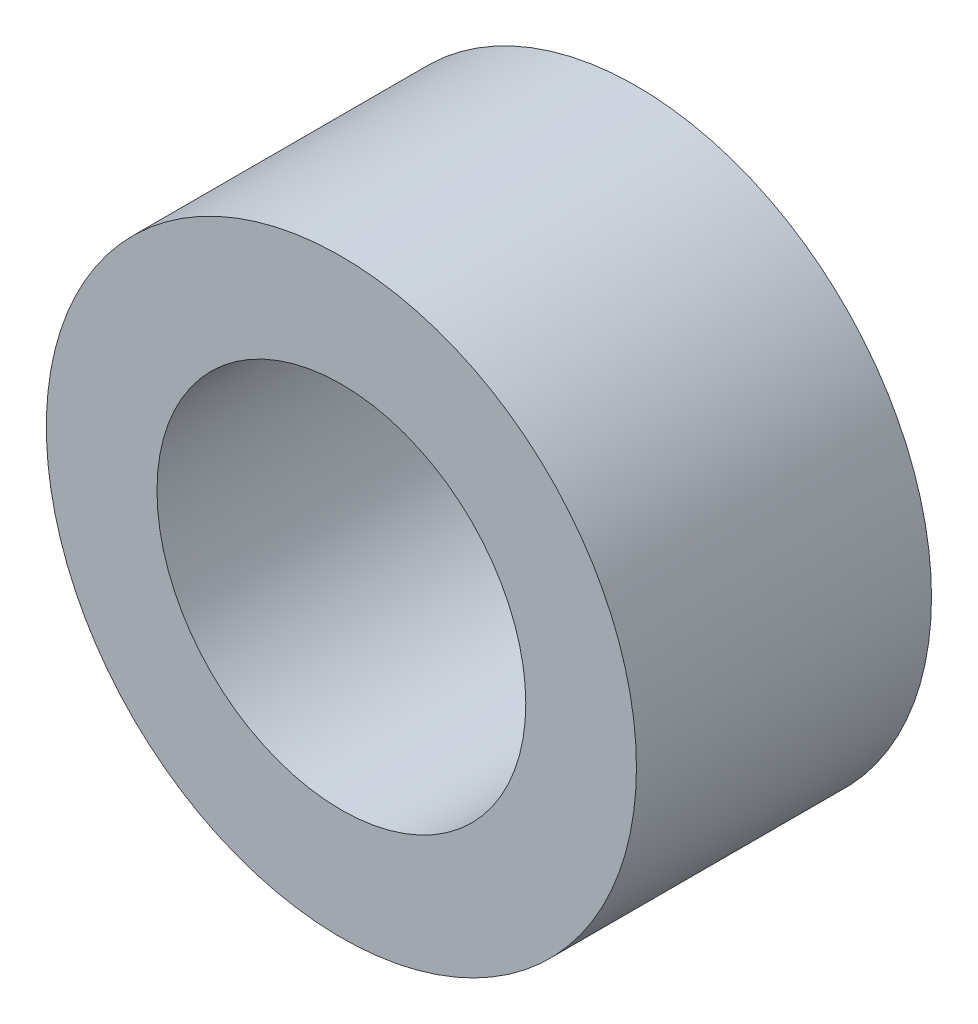
ISO-10303-21;
HEADER;
FILE_DESCRIPTION(('STEP AP214'),'2;1');
FILE_NAME('part.step','',(''),(''),'','','');
FILE_SCHEMA(('AUTOMOTIVE_DESIGN { 1 0 10303 214 1 1 1 1 }'));
ENDSEC;
DATA;
#1=APPLICATION_CONTEXT('core data for automotive mechanical design processes');
#2=APPLICATION_PROTOCOL_DEFINITION('international standard','automotive_design',2000,#1);
#3=PRODUCT_CONTEXT('',#1,'mechanical');
#4=PRODUCT('Part','Part','',(#3));
#5=PRODUCT_RELATED_PRODUCT_CATEGORY('part','',(#4));
#6=PRODUCT_DEFINITION_FORMATION('','',#4);
#7=PRODUCT_DEFINITION_CONTEXT('part definition',#1,'design');
#8=PRODUCT_DEFINITION('design','',#6,#7);
#9=PRODUCT_DEFINITION_SHAPE('','',#8);
#10=(LENGTH_UNIT() NAMED_UNIT(*) SI_UNIT(.MILLI.,.METRE.));
#11=(NAMED_UNIT(*) PLANE_ANGLE_UNIT() SI_UNIT($,.RADIAN.));
#12=(NAMED_UNIT(*) SI_UNIT($,.STERADIAN.) SOLID_ANGLE_UNIT());
#13=UNCERTAINTY_MEASURE_WITH_UNIT(LENGTH_MEASURE(1.E-05),#10,'distance_accuracy_value','');
#14=(GEOMETRIC_REPRESENTATION_CONTEXT(3) GLOBAL_UNCERTAINTY_ASSIGNED_CONTEXT((#13)) GLOBAL_UNIT_ASSIGNED_CONTEXT((#10,
#11,#12)) REPRESENTATION_CONTEXT('',''));
#15=CARTESIAN_POINT('',(0.,0.,0.));
#16=DIRECTION('',(0.,0.,1.));
#17=DIRECTION('',(1.,0.,0.));
#18=AXIS2_PLACEMENT_3D('',#15,#16,#17);
#19=CARTESIAN_POINT('',(0.,0.,5.));
#20=DIRECTION('',(0.,0.,1.));
#21=DIRECTION('',(1.,0.,0.));
#22=AXIS2_PLACEMENT_3D('',#19,#20,#21);
#23=PLANE('',#22);
#24=CARTESIAN_POINT('',(0.,0.,5.));
#25=DIRECTION('',(0.,0.,1.));
#26=DIRECTION('',(1.,0.,0.));
#27=AXIS2_PLACEMENT_3D('',#24,#25,#26);
#28=CIRCLE('',#27,5.);
#29=CARTESIAN_POINT('',(5.,0.,5.));
#30=VERTEX_POINT('',#29);
#31=EDGE_CURVE('E10',#30,#30,#28,.T.);
#32=ORIENTED_EDGE('',*,*,#31,.T.);
#33=EDGE_LOOP('',(#32));
#34=FACE_BOUND('',#33,.T.);
#35=CARTESIAN_POINT('',(0.,0.,5.));
#36=DIRECTION('',(0.,0.,1.));
#37=DIRECTION('',(1.,0.,0.));
#38=AXIS2_PLACEMENT_3D('',#35,#36,#37);
#39=CIRCLE('',#38,3.125);
#40=CARTESIAN_POINT('',(3.125,0.,5.));
#41=VERTEX_POINT('',#40);
#42=EDGE_CURVE('E46',#41,#41,#39,.T.);
#43=ORIENTED_EDGE('',*,*,#42,.F.);
#44=EDGE_LOOP('',(#43));
#45=FACE_BOUND('',#44,.T.);
#46=ADVANCED_FACE('F35',(#34,#45),#23,.T.);
#47=CARTESIAN_POINT('',(0.,0.,0.));
#48=DIRECTION('',(0.,0.,1.));
#49=DIRECTION('',(1.,0.,0.));
#50=AXIS2_PLACEMENT_3D('',#47,#48,#49);
#51=PLANE('',#50);
#52=CARTESIAN_POINT('',(0.,0.,0.));
#53=DIRECTION('',(0.,0.,1.));
#54=DIRECTION('',(1.,0.,0.));
#55=AXIS2_PLACEMENT_3D('',#52,#53,#54);
#56=CIRCLE('',#55,5.);
#57=CARTESIAN_POINT('',(5.,0.,0.));
#58=VERTEX_POINT('',#57);
#59=EDGE_CURVE('E39',#58,#58,#56,.T.);
#60=ORIENTED_EDGE('',*,*,#59,.F.);
#61=EDGE_LOOP('',(#60));
#62=FACE_BOUND('',#61,.T.);
#63=CARTESIAN_POINT('',(0.,0.,0.));
#64=DIRECTION('',(0.,0.,1.));
#65=DIRECTION('',(1.,0.,0.));
#66=AXIS2_PLACEMENT_3D('',#63,#64,#65);
#67=CIRCLE('',#66,3.125);
#68=CARTESIAN_POINT('',(3.125,0.,0.));
#69=VERTEX_POINT('',#68);
#70=EDGE_CURVE('E48',#69,#69,#67,.T.);
#71=ORIENTED_EDGE('',*,*,#70,.T.);
#72=EDGE_LOOP('',(#71));
#73=FACE_BOUND('',#72,.T.);
#74=ADVANCED_FACE('F58',(#62,#73),#51,.F.);
#75=CARTESIAN_POINT('',(0.,0.,5.));
#76=DIRECTION('',(0.,0.,-1.));
#77=DIRECTION('',(-1.,0.,0.));
#78=AXIS2_PLACEMENT_3D('',#75,#76,#77);
#79=CYLINDRICAL_SURFACE('',#78,5.);
#80=ORIENTED_EDGE('',*,*,#31,.F.);
#81=EDGE_LOOP('',(#80));
#82=FACE_BOUND('',#81,.T.);
#83=ORIENTED_EDGE('',*,*,#59,.T.);
#84=EDGE_LOOP('',(#83));
#85=FACE_BOUND('',#84,.T.);
#86=ADVANCED_FACE('F37',(#82,#85),#79,.T.);
#87=CARTESIAN_POINT('',(0.,0.,5.));
#88=DIRECTION('',(0.,0.,-1.));
#89=DIRECTION('',(-1.,0.,0.));
#90=AXIS2_PLACEMENT_3D('',#87,#88,#89);
#91=CYLINDRICAL_SURFACE('',#90,3.125);
#92=ORIENTED_EDGE('',*,*,#42,.T.);
#93=EDGE_LOOP('',(#92));
#94=FACE_BOUND('',#93,.T.);
#95=ORIENTED_EDGE('',*,*,#70,.F.);
#96=EDGE_LOOP('',(#95));
#97=FACE_BOUND('',#96,.T.);
#98=ADVANCED_FACE('F54',(#94,#97),#91,.F.);
#99=CLOSED_SHELL('',(#46,#74,#86,#98));
#100=MANIFOLD_SOLID_BREP('B2',#99);
#101=ADVANCED_BREP_SHAPE_REPRESENTATION('',(#18,#100),#14);
#102=SHAPE_DEFINITION_REPRESENTATION(#9,#101);
ENDSEC;
END-ISO-10303-21;
